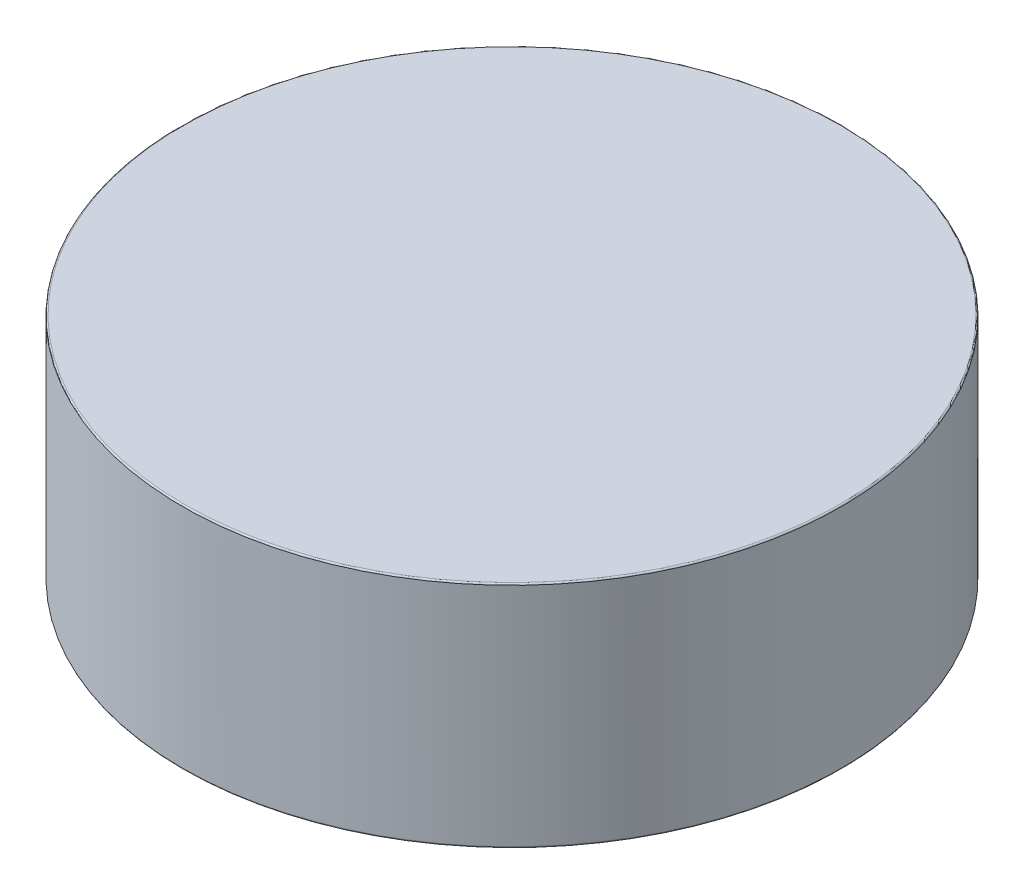
ISO-10303-21;
HEADER;
FILE_DESCRIPTION(('STEP AP214'),'2;1');
FILE_NAME('part.step','',(''),(''),'','','');
FILE_SCHEMA(('AUTOMOTIVE_DESIGN { 1 0 10303 214 1 1 1 1 }'));
ENDSEC;
DATA;
#1=APPLICATION_CONTEXT('core data for automotive mechanical design processes');
#2=APPLICATION_PROTOCOL_DEFINITION('international standard','automotive_design',2000,#1);
#3=PRODUCT_CONTEXT('',#1,'mechanical');
#4=PRODUCT('Part','Part','',(#3));
#5=PRODUCT_RELATED_PRODUCT_CATEGORY('part','',(#4));
#6=PRODUCT_DEFINITION_FORMATION('','',#4);
#7=PRODUCT_DEFINITION_CONTEXT('part definition',#1,'design');
#8=PRODUCT_DEFINITION('design','',#6,#7);
#9=PRODUCT_DEFINITION_SHAPE('','',#8);
#10=(LENGTH_UNIT() NAMED_UNIT(*) SI_UNIT(.MILLI.,.METRE.));
#11=(NAMED_UNIT(*) PLANE_ANGLE_UNIT() SI_UNIT($,.RADIAN.));
#12=(NAMED_UNIT(*) SI_UNIT($,.STERADIAN.) SOLID_ANGLE_UNIT());
#13=UNCERTAINTY_MEASURE_WITH_UNIT(LENGTH_MEASURE(1.E-05),#10,'distance_accuracy_value','');
#14=(GEOMETRIC_REPRESENTATION_CONTEXT(3) GLOBAL_UNCERTAINTY_ASSIGNED_CONTEXT((#13)) GLOBAL_UNIT_ASSIGNED_CONTEXT((#10,
#11,#12)) REPRESENTATION_CONTEXT('',''));
#15=CARTESIAN_POINT('',(0.,0.,0.));
#16=DIRECTION('',(0.,0.,1.));
#17=DIRECTION('',(1.,0.,0.));
#18=AXIS2_PLACEMENT_3D('',#15,#16,#17);
#19=CARTESIAN_POINT('',(0.,16.,0.));
#20=DIRECTION('',(0.,1.,0.));
#21=DIRECTION('',(0.,0.,1.));
#22=AXIS2_PLACEMENT_3D('',#19,#20,#21);
#23=PLANE('',#22);
#24=CARTESIAN_POINT('',(0.,16.,0.));
#25=DIRECTION('',(0.,-1.,0.));
#26=DIRECTION('',(0.,0.,-1.));
#27=AXIS2_PLACEMENT_3D('',#24,#25,#26);
#28=CIRCLE('',#27,22.9);
#29=CARTESIAN_POINT('',(0.,16.,-22.9));
#30=VERTEX_POINT('',#29);
#31=CARTESIAN_POINT('',(0.,16.,22.9));
#32=VERTEX_POINT('',#31);
#33=EDGE_CURVE('E49',#30,#32,#28,.T.);
#34=ORIENTED_EDGE('',*,*,#33,.F.);
#35=CARTESIAN_POINT('',(0.,16.,0.));
#36=DIRECTION('',(0.,-1.,0.));
#37=DIRECTION('',(0.,0.,1.));
#38=AXIS2_PLACEMENT_3D('',#35,#36,#37);
#39=CIRCLE('',#38,22.9);
#40=EDGE_CURVE('E53',#32,#30,#39,.T.);
#41=ORIENTED_EDGE('',*,*,#40,.F.);
#42=EDGE_LOOP('',(#34,#41));
#43=FACE_BOUND('',#42,.T.);
#44=ADVANCED_FACE('F24',(#43),#23,.T.);
#45=CARTESIAN_POINT('',(0.,15.9,0.));
#46=DIRECTION('',(0.,1.,0.));
#47=DIRECTION('',(0.,0.,1.));
#48=AXIS2_PLACEMENT_3D('',#45,#46,#47);
#49=TOROIDAL_SURFACE('',#48,22.9,0.1);
#50=CARTESIAN_POINT('',(0.,15.9,0.));
#51=DIRECTION('',(0.,-1.,0.));
#52=DIRECTION('',(0.,0.,-1.));
#53=AXIS2_PLACEMENT_3D('',#50,#51,#52);
#54=CIRCLE('',#53,23.);
#55=CARTESIAN_POINT('',(0.,15.9,-23.));
#56=VERTEX_POINT('',#55);
#57=EDGE_CURVE('E59',#56,#56,#54,.T.);
#58=ORIENTED_EDGE('',*,*,#57,.F.);
#59=EDGE_LOOP('',(#58));
#60=FACE_BOUND('',#59,.T.);
#61=ORIENTED_EDGE('',*,*,#40,.T.);
#62=ORIENTED_EDGE('',*,*,#33,.T.);
#63=EDGE_LOOP('',(#61,#62));
#64=FACE_BOUND('',#63,.T.);
#65=ADVANCED_FACE('F58',(#60,#64),#49,.T.);
#66=CARTESIAN_POINT('',(0.,16.,0.));
#67=DIRECTION('',(0.,-1.,0.));
#68=DIRECTION('',(0.,0.,-1.));
#69=AXIS2_PLACEMENT_3D('',#66,#67,#68);
#70=CYLINDRICAL_SURFACE('',#69,23.);
#71=ORIENTED_EDGE('',*,*,#57,.T.);
#72=EDGE_LOOP('',(#71));
#73=FACE_BOUND('',#72,.T.);
#74=CARTESIAN_POINT('',(0.,0.0999999999999994,0.));
#75=DIRECTION('',(0.,1.,0.));
#76=DIRECTION('',(0.,0.,1.));
#77=AXIS2_PLACEMENT_3D('',#74,#75,#76);
#78=CIRCLE('',#77,23.);
#79=CARTESIAN_POINT('',(0.,0.0999999999999994,23.));
#80=VERTEX_POINT('',#79);
#81=EDGE_CURVE('E84',#80,#80,#78,.F.);
#82=ORIENTED_EDGE('',*,*,#81,.F.);
#83=EDGE_LOOP('',(#82));
#84=FACE_BOUND('',#83,.T.);
#85=ADVANCED_FACE('F76',(#73,#84),#70,.T.);
#86=CARTESIAN_POINT('',(0.,0.0999999999999994,0.));
#87=DIRECTION('',(0.,1.,0.));
#88=DIRECTION('',(0.,0.,1.));
#89=AXIS2_PLACEMENT_3D('',#86,#87,#88);
#90=TOROIDAL_SURFACE('',#89,22.9,0.1);
#91=CARTESIAN_POINT('',(0.,0.,0.));
#92=DIRECTION('',(0.,1.,0.));
#93=DIRECTION('',(0.,0.,1.));
#94=AXIS2_PLACEMENT_3D('',#91,#92,#93);
#95=CIRCLE('',#94,22.9);
#96=CARTESIAN_POINT('',(0.,0.,22.9));
#97=VERTEX_POINT('',#96);
#98=CARTESIAN_POINT('',(0.,0.,-22.9));
#99=VERTEX_POINT('',#98);
#100=EDGE_CURVE('E35',#97,#99,#95,.T.);
#101=ORIENTED_EDGE('',*,*,#100,.T.);
#102=CARTESIAN_POINT('',(0.,0.,0.));
#103=DIRECTION('',(0.,1.,0.));
#104=DIRECTION('',(0.,0.,-1.));
#105=AXIS2_PLACEMENT_3D('',#102,#103,#104);
#106=CIRCLE('',#105,22.9);
#107=EDGE_CURVE('E13',#99,#97,#106,.T.);
#108=ORIENTED_EDGE('',*,*,#107,.T.);
#109=EDGE_LOOP('',(#101,#108));
#110=FACE_BOUND('',#109,.T.);
#111=ORIENTED_EDGE('',*,*,#81,.T.);
#112=EDGE_LOOP('',(#111));
#113=FACE_BOUND('',#112,.T.);
#114=ADVANCED_FACE('F91',(#110,#113),#90,.T.);
#115=CARTESIAN_POINT('',(0.,0.,0.));
#116=DIRECTION('',(0.,1.,0.));
#117=DIRECTION('',(0.,0.,1.));
#118=AXIS2_PLACEMENT_3D('',#115,#116,#117);
#119=PLANE('',#118);
#120=ORIENTED_EDGE('',*,*,#100,.F.);
#121=ORIENTED_EDGE('',*,*,#107,.F.);
#122=EDGE_LOOP('',(#120,#121));
#123=FACE_BOUND('',#122,.T.);
#124=ADVANCED_FACE('F100',(#123),#119,.F.);
#125=CLOSED_SHELL('',(#44,#65,#85,#114,#124));
#126=MANIFOLD_SOLID_BREP('B1',#125);
#127=ADVANCED_BREP_SHAPE_REPRESENTATION('',(#18,#126),#14);
#128=SHAPE_DEFINITION_REPRESENTATION(#9,#127);
ENDSEC;
END-ISO-10303-21;
